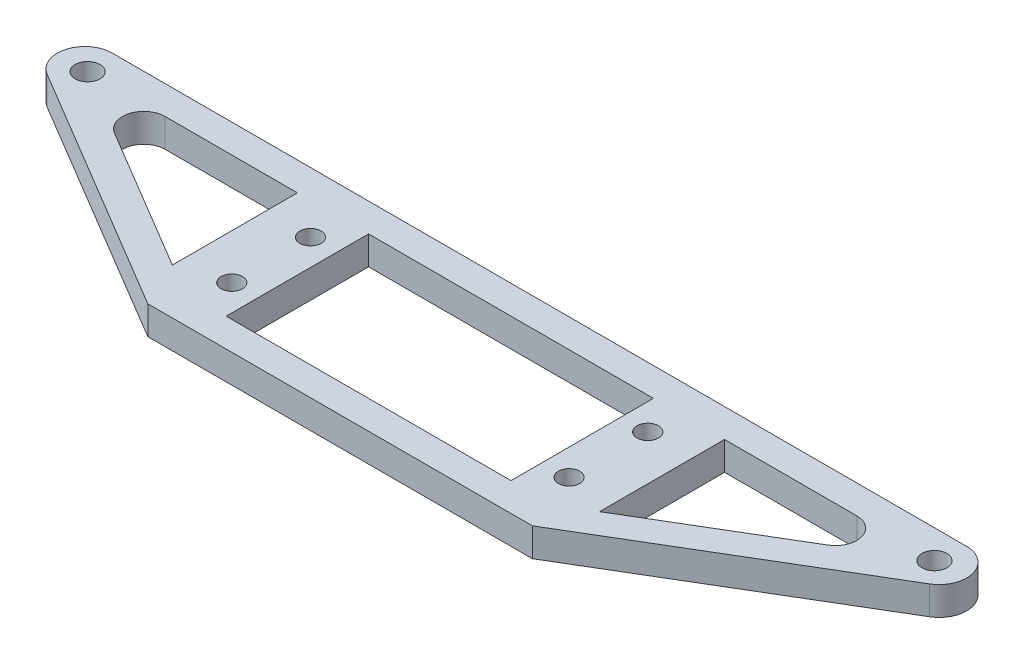
ISO-10303-21;
HEADER;
FILE_DESCRIPTION(('STEP AP214'),'2;1');
FILE_NAME('part.step','',(''),(''),'','','');
FILE_SCHEMA(('AUTOMOTIVE_DESIGN { 1 0 10303 214 1 1 1 1 }'));
ENDSEC;
DATA;
#1=APPLICATION_CONTEXT('core data for automotive mechanical design processes');
#2=APPLICATION_PROTOCOL_DEFINITION('international standard','automotive_design',2000,#1);
#3=PRODUCT_CONTEXT('',#1,'mechanical');
#4=PRODUCT('Part','Part','',(#3));
#5=PRODUCT_RELATED_PRODUCT_CATEGORY('part','',(#4));
#6=PRODUCT_DEFINITION_FORMATION('','',#4);
#7=PRODUCT_DEFINITION_CONTEXT('part definition',#1,'design');
#8=PRODUCT_DEFINITION('design','',#6,#7);
#9=PRODUCT_DEFINITION_SHAPE('','',#8);
#10=(LENGTH_UNIT() NAMED_UNIT(*) SI_UNIT(.MILLI.,.METRE.));
#11=(NAMED_UNIT(*) PLANE_ANGLE_UNIT() SI_UNIT($,.RADIAN.));
#12=(NAMED_UNIT(*) SI_UNIT($,.STERADIAN.) SOLID_ANGLE_UNIT());
#13=UNCERTAINTY_MEASURE_WITH_UNIT(LENGTH_MEASURE(1.E-05),#10,'distance_accuracy_value','');
#14=(GEOMETRIC_REPRESENTATION_CONTEXT(3) GLOBAL_UNCERTAINTY_ASSIGNED_CONTEXT((#13)) GLOBAL_UNIT_ASSIGNED_CONTEXT((#10,
#11,#12)) REPRESENTATION_CONTEXT('',''));
#15=CARTESIAN_POINT('',(0.,0.,0.));
#16=DIRECTION('',(0.,0.,1.));
#17=DIRECTION('',(1.,0.,0.));
#18=AXIS2_PLACEMENT_3D('',#15,#16,#17);
#19=CARTESIAN_POINT('',(60.,4.,-10.1471353709543));
#20=DIRECTION('',(0.,1.,0.));
#21=DIRECTION('',(0.,0.,1.));
#22=AXIS2_PLACEMENT_3D('',#19,#20,#21);
#23=PLANE('',#22);
#24=CARTESIAN_POINT('',(-59.4656013149664,4.,-10.));
#25=DIRECTION('',(0.,1.,0.));
#26=DIRECTION('',(0.,0.,1.));
#27=AXIS2_PLACEMENT_3D('',#24,#25,#26);
#28=CIRCLE('',#27,1.75);
#29=CARTESIAN_POINT('',(-59.4656013149664,4.,-8.25));
#30=VERTEX_POINT('',#29);
#31=EDGE_CURVE('E191',#30,#30,#28,.T.);
#32=ORIENTED_EDGE('',*,*,#31,.F.);
#33=EDGE_LOOP('',(#32));
#34=FACE_BOUND('',#33,.T.);
#35=CARTESIAN_POINT('',(59.4656013149664,4.,-10.));
#36=DIRECTION('',(0.,1.,0.));
#37=DIRECTION('',(0.,0.,1.));
#38=AXIS2_PLACEMENT_3D('',#35,#36,#37);
#39=CIRCLE('',#38,1.75);
#40=CARTESIAN_POINT('',(59.4656013149664,4.,-8.25));
#41=VERTEX_POINT('',#40);
#42=EDGE_CURVE('E649',#41,#41,#39,.T.);
#43=ORIENTED_EDGE('',*,*,#42,.F.);
#44=EDGE_LOOP('',(#43));
#45=FACE_BOUND('',#44,.T.);
#46=CARTESIAN_POINT('',(23.6809604637574,4.,5.52949784874383));
#47=DIRECTION('',(0.,1.,0.));
#48=DIRECTION('',(0.,0.,1.));
#49=AXIS2_PLACEMENT_3D('',#46,#47,#48);
#50=CIRCLE('',#49,1.5);
#51=CARTESIAN_POINT('',(23.6809604637574,4.,7.02949784874383));
#52=VERTEX_POINT('',#51);
#53=EDGE_CURVE('E225',#52,#52,#50,.T.);
#54=ORIENTED_EDGE('',*,*,#53,.F.);
#55=EDGE_LOOP('',(#54));
#56=FACE_BOUND('',#55,.T.);
#57=CARTESIAN_POINT('',(-23.6809604637574,4.,-5.52949784874374));
#58=DIRECTION('',(0.,1.,0.));
#59=DIRECTION('',(0.,0.,1.));
#60=AXIS2_PLACEMENT_3D('',#57,#58,#59);
#61=CIRCLE('',#60,1.5);
#62=CARTESIAN_POINT('',(-23.6809604637574,4.,-4.02949784874374));
#63=VERTEX_POINT('',#62);
#64=EDGE_CURVE('E237',#63,#63,#61,.T.);
#65=ORIENTED_EDGE('',*,*,#64,.F.);
#66=EDGE_LOOP('',(#65));
#67=FACE_BOUND('',#66,.T.);
#68=DIRECTION('',(-1.,0.,0.));
#69=VECTOR('',#68,1.);
#70=CARTESIAN_POINT('',(26.9999999999999,4.,-14.));
#71=LINE('',#70,#69);
#72=CARTESIAN_POINT('',(60.,4.,-14.));
#73=VERTEX_POINT('',#72);
#74=CARTESIAN_POINT('',(-60.,4.,-14.));
#75=VERTEX_POINT('',#74);
#76=EDGE_CURVE('E274',#73,#75,#71,.T.);
#77=ORIENTED_EDGE('',*,*,#76,.T.);
#78=CARTESIAN_POINT('',(-60.,4.,-10.1471353709543));
#79=DIRECTION('',(0.,1.,0.));
#80=DIRECTION('',(0.,0.,-1.));
#81=AXIS2_PLACEMENT_3D('',#78,#79,#80);
#82=CIRCLE('',#81,3.8528646290457);
#83=CARTESIAN_POINT('',(-61.9721116707928,4.,-6.83724996392368));
#84=VERTEX_POINT('',#83);
#85=EDGE_CURVE('E276',#75,#84,#82,.T.);
#86=ORIENTED_EDGE('',*,*,#85,.T.);
#87=DIRECTION('',(0.859071295180808,0.,0.511855946332919));
#88=VECTOR('',#87,1.);
#89=CARTESIAN_POINT('',(-27.0000000000001,4.,14.));
#90=LINE('',#89,#88);
#91=CARTESIAN_POINT('',(-27.0000000000001,4.,14.));
#92=VERTEX_POINT('',#91);
#93=EDGE_CURVE('E279',#84,#92,#90,.T.);
#94=ORIENTED_EDGE('',*,*,#93,.T.);
#95=DIRECTION('',(1.,0.,0.));
#96=VECTOR('',#95,1.);
#97=CARTESIAN_POINT('',(-27.0000000000001,4.,14.));
#98=LINE('',#97,#96);
#99=CARTESIAN_POINT('',(26.9999999999999,4.,14.));
#100=VERTEX_POINT('',#99);
#101=EDGE_CURVE('E281',#92,#100,#98,.T.);
#102=ORIENTED_EDGE('',*,*,#101,.T.);
#103=DIRECTION('',(0.859071295180809,0.,-0.511855946332918));
#104=VECTOR('',#103,1.);
#105=CARTESIAN_POINT('',(26.9999999999999,4.,14.));
#106=LINE('',#105,#104);
#107=CARTESIAN_POINT('',(61.9721116707928,4.,-6.83724996392368));
#108=VERTEX_POINT('',#107);
#109=EDGE_CURVE('E283',#100,#108,#106,.T.);
#110=ORIENTED_EDGE('',*,*,#109,.T.);
#111=CARTESIAN_POINT('',(60.,4.,-10.1471353709543));
#112=DIRECTION('',(0.,1.,0.));
#113=DIRECTION('',(0.,0.,1.));
#114=AXIS2_PLACEMENT_3D('',#111,#112,#113);
#115=CIRCLE('',#114,3.8528646290457);
#116=EDGE_CURVE('E285',#108,#73,#115,.T.);
#117=ORIENTED_EDGE('',*,*,#116,.T.);
#118=EDGE_LOOP('',(#77,#86,#94,#102,#110,#117));
#119=FACE_BOUND('',#118,.T.);
#120=DIRECTION('',(-1.,0.,0.));
#121=VECTOR('',#120,1.);
#122=CARTESIAN_POINT('',(-20.,4.,-10.));
#123=LINE('',#122,#121);
#124=CARTESIAN_POINT('',(20.,4.,-10.));
#125=VERTEX_POINT('',#124);
#126=CARTESIAN_POINT('',(-20.,4.,-10.));
#127=VERTEX_POINT('',#126);
#128=EDGE_CURVE('E245',#125,#127,#123,.T.);
#129=ORIENTED_EDGE('',*,*,#128,.F.);
#130=DIRECTION('',(0.,0.,-1.));
#131=VECTOR('',#130,1.);
#132=CARTESIAN_POINT('',(20.,4.,10.));
#133=LINE('',#132,#131);
#134=CARTESIAN_POINT('',(20.,4.,10.));
#135=VERTEX_POINT('',#134);
#136=EDGE_CURVE('E243',#135,#125,#133,.T.);
#137=ORIENTED_EDGE('',*,*,#136,.F.);
#138=DIRECTION('',(1.,0.,0.));
#139=VECTOR('',#138,1.);
#140=CARTESIAN_POINT('',(-20.,4.,10.));
#141=LINE('',#140,#139);
#142=CARTESIAN_POINT('',(-20.,4.,10.));
#143=VERTEX_POINT('',#142);
#144=EDGE_CURVE('E251',#143,#135,#141,.T.);
#145=ORIENTED_EDGE('',*,*,#144,.F.);
#146=DIRECTION('',(0.,0.,1.));
#147=VECTOR('',#146,1.);
#148=CARTESIAN_POINT('',(-20.,4.,10.));
#149=LINE('',#148,#147);
#150=EDGE_CURVE('E248',#127,#143,#149,.T.);
#151=ORIENTED_EDGE('',*,*,#150,.F.);
#152=EDGE_LOOP('',(#129,#137,#145,#151));
#153=FACE_BOUND('',#152,.T.);
#154=CARTESIAN_POINT('',(-23.6809604637574,4.,5.52949784874374));
#155=DIRECTION('',(0.,1.,0.));
#156=DIRECTION('',(0.,0.,-1.));
#157=AXIS2_PLACEMENT_3D('',#154,#155,#156);
#158=CIRCLE('',#157,1.5);
#159=CARTESIAN_POINT('',(-23.6809604637574,4.,4.02949784874374));
#160=VERTEX_POINT('',#159);
#161=EDGE_CURVE('E231',#160,#160,#158,.T.);
#162=ORIENTED_EDGE('',*,*,#161,.F.);
#163=EDGE_LOOP('',(#162));
#164=FACE_BOUND('',#163,.T.);
#165=CARTESIAN_POINT('',(23.6809604637574,4.,-5.52949784874365));
#166=DIRECTION('',(0.,1.,0.));
#167=DIRECTION('',(0.,0.,-1.));
#168=AXIS2_PLACEMENT_3D('',#165,#166,#167);
#169=CIRCLE('',#168,1.5);
#170=CARTESIAN_POINT('',(23.6809604637574,4.,-7.02949784874365));
#171=VERTEX_POINT('',#170);
#172=EDGE_CURVE('E219',#171,#171,#169,.T.);
#173=ORIENTED_EDGE('',*,*,#172,.F.);
#174=EDGE_LOOP('',(#173));
#175=FACE_BOUND('',#174,.T.);
#176=DIRECTION('',(0.859071295180809,0.,-0.511855946332919));
#177=VECTOR('',#176,1.);
#178=CARTESIAN_POINT('',(59.4656013149664,4.,-10.));
#179=LINE('',#178,#177);
#180=CARTESIAN_POINT('',(30.,4.,7.55633476516793));
#181=VERTEX_POINT('',#180);
#182=CARTESIAN_POINT('',(50.1051076243509,4.,-4.42278611445758));
#183=VERTEX_POINT('',#182);
#184=EDGE_CURVE('E200',#181,#183,#179,.T.);
#185=ORIENTED_EDGE('',*,*,#184,.F.);
#186=DIRECTION('',(0.,0.,1.));
#187=VECTOR('',#186,1.);
#188=CARTESIAN_POINT('',(30.,4.,7.55633476516793));
#189=LINE('',#188,#187);
#190=CARTESIAN_POINT('',(29.9999999999999,4.,-10.));
#191=VERTEX_POINT('',#190);
#192=EDGE_CURVE('E198',#191,#181,#189,.T.);
#193=ORIENTED_EDGE('',*,*,#192,.F.);
#194=DIRECTION('',(-1.,0.,0.));
#195=VECTOR('',#194,1.);
#196=CARTESIAN_POINT('',(29.9999999999999,4.,-10.));
#197=LINE('',#196,#195);
#198=CARTESIAN_POINT('',(48.5695397853522,4.,-10.));
#199=VERTEX_POINT('',#198);
#200=EDGE_CURVE('E204',#199,#191,#197,.T.);
#201=ORIENTED_EDGE('',*,*,#200,.F.);
#202=CARTESIAN_POINT('',(48.5695397853522,4.,-7.));
#203=DIRECTION('',(0.,1.,0.));
#204=DIRECTION('',(0.,0.,1.));
#205=AXIS2_PLACEMENT_3D('',#202,#203,#204);
#206=CIRCLE('',#205,3.);
#207=EDGE_CURVE('E323',#199,#183,#206,.F.);
#208=ORIENTED_EDGE('',*,*,#207,.T.);
#209=EDGE_LOOP('',(#185,#193,#201,#208));
#210=FACE_BOUND('',#209,.T.);
#211=DIRECTION('',(0.859071295180809,0.,0.511855946332919));
#212=VECTOR('',#211,1.);
#213=CARTESIAN_POINT('',(-59.4656013149664,4.,-10.));
#214=LINE('',#213,#212);
#215=CARTESIAN_POINT('',(-50.1051076243509,4.,-4.42278611445757));
#216=VERTEX_POINT('',#215);
#217=CARTESIAN_POINT('',(-29.9999999999999,4.,7.55633476516793));
#218=VERTEX_POINT('',#217);
#219=EDGE_CURVE('E174',#216,#218,#214,.T.);
#220=ORIENTED_EDGE('',*,*,#219,.F.);
#221=CARTESIAN_POINT('',(-48.5695397853522,4.,-7.));
#222=DIRECTION('',(0.,1.,0.));
#223=DIRECTION('',(0.,0.,1.));
#224=AXIS2_PLACEMENT_3D('',#221,#222,#223);
#225=CIRCLE('',#224,3.);
#226=CARTESIAN_POINT('',(-48.5695397853522,4.,-10.));
#227=VERTEX_POINT('',#226);
#228=EDGE_CURVE('E11',#216,#227,#225,.F.);
#229=ORIENTED_EDGE('',*,*,#228,.T.);
#230=DIRECTION('',(-1.,0.,0.));
#231=VECTOR('',#230,1.);
#232=CARTESIAN_POINT('',(-29.9999999999999,4.,-10.));
#233=LINE('',#232,#231);
#234=CARTESIAN_POINT('',(-29.9999999999999,4.,-10.));
#235=VERTEX_POINT('',#234);
#236=EDGE_CURVE('E180',#235,#227,#233,.T.);
#237=ORIENTED_EDGE('',*,*,#236,.F.);
#238=DIRECTION('',(0.,0.,-1.));
#239=VECTOR('',#238,1.);
#240=CARTESIAN_POINT('',(-30.,4.,7.55633476516793));
#241=LINE('',#240,#239);
#242=EDGE_CURVE('E164',#218,#235,#241,.T.);
#243=ORIENTED_EDGE('',*,*,#242,.F.);
#244=EDGE_LOOP('',(#220,#229,#237,#243));
#245=FACE_BOUND('',#244,.T.);
#246=ADVANCED_FACE('F40',(#34,#45,#56,#67,#119,#153,#164,#175,#210,#245),#23,.T.);
#247=CARTESIAN_POINT('',(60.,0.,-10.1471353709543));
#248=DIRECTION('',(0.,1.,0.));
#249=DIRECTION('',(0.,0.,1.));
#250=AXIS2_PLACEMENT_3D('',#247,#248,#249);
#251=PLANE('',#250);
#252=CARTESIAN_POINT('',(-59.4656013149664,0.,-10.));
#253=DIRECTION('',(0.,1.,0.));
#254=DIRECTION('',(0.,0.,1.));
#255=AXIS2_PLACEMENT_3D('',#252,#253,#254);
#256=CIRCLE('',#255,1.75);
#257=CARTESIAN_POINT('',(-59.4656013149664,0.,-8.25));
#258=VERTEX_POINT('',#257);
#259=EDGE_CURVE('E648',#258,#258,#256,.T.);
#260=ORIENTED_EDGE('',*,*,#259,.T.);
#261=EDGE_LOOP('',(#260));
#262=FACE_BOUND('',#261,.T.);
#263=CARTESIAN_POINT('',(59.4656013149664,0.,-10.));
#264=DIRECTION('',(0.,1.,0.));
#265=DIRECTION('',(0.,0.,1.));
#266=AXIS2_PLACEMENT_3D('',#263,#264,#265);
#267=CIRCLE('',#266,1.75);
#268=CARTESIAN_POINT('',(59.4656013149664,0.,-8.25));
#269=VERTEX_POINT('',#268);
#270=EDGE_CURVE('E650',#269,#269,#267,.T.);
#271=ORIENTED_EDGE('',*,*,#270,.T.);
#272=EDGE_LOOP('',(#271));
#273=FACE_BOUND('',#272,.T.);
#274=DIRECTION('',(0.,0.,1.));
#275=VECTOR('',#274,1.);
#276=CARTESIAN_POINT('',(30.,0.,7.55633476516793));
#277=LINE('',#276,#275);
#278=CARTESIAN_POINT('',(29.9999999999999,0.,-10.));
#279=VERTEX_POINT('',#278);
#280=CARTESIAN_POINT('',(30.,0.,7.55633476516793));
#281=VERTEX_POINT('',#280);
#282=EDGE_CURVE('E197',#279,#281,#277,.T.);
#283=ORIENTED_EDGE('',*,*,#282,.T.);
#284=DIRECTION('',(0.859071295180809,0.,-0.511855946332919));
#285=VECTOR('',#284,1.);
#286=CARTESIAN_POINT('',(59.4656013149664,0.,-10.));
#287=LINE('',#286,#285);
#288=CARTESIAN_POINT('',(50.1051076243509,0.,-4.42278611445758));
#289=VERTEX_POINT('',#288);
#290=EDGE_CURVE('E209',#281,#289,#287,.T.);
#291=ORIENTED_EDGE('',*,*,#290,.T.);
#292=CARTESIAN_POINT('',(48.5695397853522,0.,-7.));
#293=DIRECTION('',(0.,1.,0.));
#294=DIRECTION('',(0.,0.,1.));
#295=AXIS2_PLACEMENT_3D('',#292,#293,#294);
#296=CIRCLE('',#295,3.);
#297=CARTESIAN_POINT('',(48.5695397853522,0.,-10.));
#298=VERTEX_POINT('',#297);
#299=EDGE_CURVE('E321',#289,#298,#296,.T.);
#300=ORIENTED_EDGE('',*,*,#299,.T.);
#301=DIRECTION('',(-1.,0.,0.));
#302=VECTOR('',#301,1.);
#303=CARTESIAN_POINT('',(29.9999999999999,0.,-10.));
#304=LINE('',#303,#302);
#305=EDGE_CURVE('E201',#298,#279,#304,.T.);
#306=ORIENTED_EDGE('',*,*,#305,.T.);
#307=EDGE_LOOP('',(#283,#291,#300,#306));
#308=FACE_BOUND('',#307,.T.);
#309=DIRECTION('',(-1.,0.,0.));
#310=VECTOR('',#309,1.);
#311=CARTESIAN_POINT('',(-27.0000000000001,0.,-14.));
#312=LINE('',#311,#310);
#313=CARTESIAN_POINT('',(60.,0.,-14.));
#314=VERTEX_POINT('',#313);
#315=CARTESIAN_POINT('',(-60.,0.,-14.));
#316=VERTEX_POINT('',#315);
#317=EDGE_CURVE('E273',#314,#316,#312,.T.);
#318=ORIENTED_EDGE('',*,*,#317,.F.);
#319=CARTESIAN_POINT('',(60.,0.,-10.1471353709543));
#320=DIRECTION('',(0.,1.,0.));
#321=DIRECTION('',(0.,0.,1.));
#322=AXIS2_PLACEMENT_3D('',#319,#320,#321);
#323=CIRCLE('',#322,3.8528646290457);
#324=CARTESIAN_POINT('',(61.9721116707928,0.,-6.83724996392368));
#325=VERTEX_POINT('',#324);
#326=EDGE_CURVE('E277',#325,#314,#323,.T.);
#327=ORIENTED_EDGE('',*,*,#326,.F.);
#328=DIRECTION('',(0.859071295180809,0.,-0.511855946332918));
#329=VECTOR('',#328,1.);
#330=CARTESIAN_POINT('',(26.9999999999999,0.,14.));
#331=LINE('',#330,#329);
#332=CARTESIAN_POINT('',(26.9999999999999,0.,14.));
#333=VERTEX_POINT('',#332);
#334=EDGE_CURVE('E295',#333,#325,#331,.T.);
#335=ORIENTED_EDGE('',*,*,#334,.F.);
#336=DIRECTION('',(1.,0.,0.));
#337=VECTOR('',#336,1.);
#338=CARTESIAN_POINT('',(-27.0000000000001,0.,14.));
#339=LINE('',#338,#337);
#340=CARTESIAN_POINT('',(-27.0000000000001,0.,14.));
#341=VERTEX_POINT('',#340);
#342=EDGE_CURVE('E293',#341,#333,#339,.T.);
#343=ORIENTED_EDGE('',*,*,#342,.F.);
#344=DIRECTION('',(0.859071295180808,0.,0.511855946332919));
#345=VECTOR('',#344,1.);
#346=CARTESIAN_POINT('',(-27.0000000000001,0.,14.));
#347=LINE('',#346,#345);
#348=CARTESIAN_POINT('',(-61.9721116707928,0.,-6.83724996392368));
#349=VERTEX_POINT('',#348);
#350=EDGE_CURVE('E291',#349,#341,#347,.T.);
#351=ORIENTED_EDGE('',*,*,#350,.F.);
#352=CARTESIAN_POINT('',(-60.,0.,-10.1471353709543));
#353=DIRECTION('',(0.,1.,0.));
#354=DIRECTION('',(0.,0.,-1.));
#355=AXIS2_PLACEMENT_3D('',#352,#353,#354);
#356=CIRCLE('',#355,3.8528646290457);
#357=EDGE_CURVE('E289',#316,#349,#356,.T.);
#358=ORIENTED_EDGE('',*,*,#357,.F.);
#359=EDGE_LOOP('',(#318,#327,#335,#343,#351,#358));
#360=FACE_BOUND('',#359,.T.);
#361=DIRECTION('',(0.,0.,-1.));
#362=VECTOR('',#361,1.);
#363=CARTESIAN_POINT('',(20.,0.,10.));
#364=LINE('',#363,#362);
#365=CARTESIAN_POINT('',(20.,0.,10.));
#366=VERTEX_POINT('',#365);
#367=CARTESIAN_POINT('',(20.,0.,-10.));
#368=VERTEX_POINT('',#367);
#369=EDGE_CURVE('E240',#366,#368,#364,.T.);
#370=ORIENTED_EDGE('',*,*,#369,.T.);
#371=DIRECTION('',(-1.,0.,0.));
#372=VECTOR('',#371,1.);
#373=CARTESIAN_POINT('',(-20.,0.,-10.));
#374=LINE('',#373,#372);
#375=CARTESIAN_POINT('',(-20.,0.,-10.));
#376=VERTEX_POINT('',#375);
#377=EDGE_CURVE('E256',#368,#376,#374,.T.);
#378=ORIENTED_EDGE('',*,*,#377,.T.);
#379=DIRECTION('',(0.,0.,1.));
#380=VECTOR('',#379,1.);
#381=CARTESIAN_POINT('',(-20.,0.,10.));
#382=LINE('',#381,#380);
#383=CARTESIAN_POINT('',(-20.,0.,10.));
#384=VERTEX_POINT('',#383);
#385=EDGE_CURVE('E259',#376,#384,#382,.T.);
#386=ORIENTED_EDGE('',*,*,#385,.T.);
#387=DIRECTION('',(1.,0.,0.));
#388=VECTOR('',#387,1.);
#389=CARTESIAN_POINT('',(-20.,0.,10.));
#390=LINE('',#389,#388);
#391=EDGE_CURVE('E246',#384,#366,#390,.T.);
#392=ORIENTED_EDGE('',*,*,#391,.T.);
#393=EDGE_LOOP('',(#370,#378,#386,#392));
#394=FACE_BOUND('',#393,.T.);
#395=CARTESIAN_POINT('',(-23.6809604637574,0.,-5.52949784874374));
#396=DIRECTION('',(0.,1.,0.));
#397=DIRECTION('',(0.,0.,1.));
#398=AXIS2_PLACEMENT_3D('',#395,#396,#397);
#399=CIRCLE('',#398,1.5);
#400=CARTESIAN_POINT('',(-23.6809604637574,0.,-4.02949784874374));
#401=VERTEX_POINT('',#400);
#402=EDGE_CURVE('E234',#401,#401,#399,.T.);
#403=ORIENTED_EDGE('',*,*,#402,.T.);
#404=EDGE_LOOP('',(#403));
#405=FACE_BOUND('',#404,.T.);
#406=CARTESIAN_POINT('',(-23.6809604637574,0.,5.52949784874374));
#407=DIRECTION('',(0.,1.,0.));
#408=DIRECTION('',(0.,0.,-1.));
#409=AXIS2_PLACEMENT_3D('',#406,#407,#408);
#410=CIRCLE('',#409,1.5);
#411=CARTESIAN_POINT('',(-23.6809604637574,0.,4.02949784874374));
#412=VERTEX_POINT('',#411);
#413=EDGE_CURVE('E228',#412,#412,#410,.T.);
#414=ORIENTED_EDGE('',*,*,#413,.T.);
#415=EDGE_LOOP('',(#414));
#416=FACE_BOUND('',#415,.T.);
#417=CARTESIAN_POINT('',(23.6809604637574,0.,5.52949784874383));
#418=DIRECTION('',(0.,1.,0.));
#419=DIRECTION('',(0.,0.,1.));
#420=AXIS2_PLACEMENT_3D('',#417,#418,#419);
#421=CIRCLE('',#420,1.5);
#422=CARTESIAN_POINT('',(23.6809604637574,0.,7.02949784874383));
#423=VERTEX_POINT('',#422);
#424=EDGE_CURVE('E222',#423,#423,#421,.T.);
#425=ORIENTED_EDGE('',*,*,#424,.T.);
#426=EDGE_LOOP('',(#425));
#427=FACE_BOUND('',#426,.T.);
#428=CARTESIAN_POINT('',(23.6809604637574,0.,-5.52949784874365));
#429=DIRECTION('',(0.,1.,0.));
#430=DIRECTION('',(0.,0.,-1.));
#431=AXIS2_PLACEMENT_3D('',#428,#429,#430);
#432=CIRCLE('',#431,1.5);
#433=CARTESIAN_POINT('',(23.6809604637574,0.,-7.02949784874365));
#434=VERTEX_POINT('',#433);
#435=EDGE_CURVE('E218',#434,#434,#432,.T.);
#436=ORIENTED_EDGE('',*,*,#435,.T.);
#437=EDGE_LOOP('',(#436));
#438=FACE_BOUND('',#437,.T.);
#439=DIRECTION('',(-1.,0.,0.));
#440=VECTOR('',#439,1.);
#441=CARTESIAN_POINT('',(-29.9999999999999,0.,-10.));
#442=LINE('',#441,#440);
#443=CARTESIAN_POINT('',(-29.9999999999999,0.,-10.));
#444=VERTEX_POINT('',#443);
#445=CARTESIAN_POINT('',(-48.5695397853522,0.,-10.));
#446=VERTEX_POINT('',#445);
#447=EDGE_CURVE('E182',#444,#446,#442,.T.);
#448=ORIENTED_EDGE('',*,*,#447,.T.);
#449=CARTESIAN_POINT('',(-48.5695397853522,0.,-7.));
#450=DIRECTION('',(0.,1.,0.));
#451=DIRECTION('',(0.,0.,1.));
#452=AXIS2_PLACEMENT_3D('',#449,#450,#451);
#453=CIRCLE('',#452,3.);
#454=CARTESIAN_POINT('',(-50.1051076243509,0.,-4.42278611445757));
#455=VERTEX_POINT('',#454);
#456=EDGE_CURVE('E48',#446,#455,#453,.T.);
#457=ORIENTED_EDGE('',*,*,#456,.T.);
#458=DIRECTION('',(0.859071295180809,0.,0.511855946332919));
#459=VECTOR('',#458,1.);
#460=CARTESIAN_POINT('',(-59.4656013149664,0.,-10.));
#461=LINE('',#460,#459);
#462=CARTESIAN_POINT('',(-30.,0.,7.55633476516793));
#463=VERTEX_POINT('',#462);
#464=EDGE_CURVE('E188',#455,#463,#461,.T.);
#465=ORIENTED_EDGE('',*,*,#464,.T.);
#466=DIRECTION('',(0.,0.,-1.));
#467=VECTOR('',#466,1.);
#468=CARTESIAN_POINT('',(-30.,0.,7.55633476516793));
#469=LINE('',#468,#467);
#470=EDGE_CURVE('E185',#463,#444,#469,.T.);
#471=ORIENTED_EDGE('',*,*,#470,.T.);
#472=EDGE_LOOP('',(#448,#457,#465,#471));
#473=FACE_BOUND('',#472,.T.);
#474=ADVANCED_FACE('F328',(#262,#273,#308,#360,#394,#405,#416,#427,#438,#473),#251,.F.);
#475=CARTESIAN_POINT('',(-27.0000000000001,4.,-14.));
#476=DIRECTION('',(0.,0.,1.));
#477=DIRECTION('',(1.,0.,0.));
#478=AXIS2_PLACEMENT_3D('',#475,#476,#477);
#479=PLANE('',#478);
#480=ORIENTED_EDGE('',*,*,#317,.T.);
#481=DIRECTION('',(0.,-1.,0.));
#482=VECTOR('',#481,1.);
#483=CARTESIAN_POINT('',(-60.,4.,-14.));
#484=LINE('',#483,#482);
#485=EDGE_CURVE('E313',#75,#316,#484,.T.);
#486=ORIENTED_EDGE('',*,*,#485,.F.);
#487=ORIENTED_EDGE('',*,*,#76,.F.);
#488=DIRECTION('',(0.,-1.,0.));
#489=VECTOR('',#488,1.);
#490=CARTESIAN_POINT('',(60.,4.,-14.));
#491=LINE('',#490,#489);
#492=EDGE_CURVE('E287',#73,#314,#491,.T.);
#493=ORIENTED_EDGE('',*,*,#492,.T.);
#494=EDGE_LOOP('',(#480,#486,#487,#493));
#495=FACE_BOUND('',#494,.T.);
#496=ADVANCED_FACE('F348',(#495),#479,.F.);
#497=CARTESIAN_POINT('',(-60.,4.,-10.1471353709543));
#498=DIRECTION('',(0.,-1.,0.));
#499=DIRECTION('',(0.,0.,-1.));
#500=AXIS2_PLACEMENT_3D('',#497,#498,#499);
#501=CYLINDRICAL_SURFACE('',#500,3.8528646290457);
#502=ORIENTED_EDGE('',*,*,#357,.T.);
#503=DIRECTION('',(0.,-1.,0.));
#504=VECTOR('',#503,1.);
#505=CARTESIAN_POINT('',(-61.9721116707928,4.,-6.83724996392368));
#506=LINE('',#505,#504);
#507=EDGE_CURVE('E310',#84,#349,#506,.T.);
#508=ORIENTED_EDGE('',*,*,#507,.F.);
#509=ORIENTED_EDGE('',*,*,#85,.F.);
#510=ORIENTED_EDGE('',*,*,#485,.T.);
#511=EDGE_LOOP('',(#502,#508,#509,#510));
#512=FACE_BOUND('',#511,.T.);
#513=ADVANCED_FACE('F372',(#512),#501,.T.);
#514=CARTESIAN_POINT('',(-27.0000000000001,4.,14.));
#515=DIRECTION('',(0.511855946332919,0.,-0.859071295180808));
#516=DIRECTION('',(-0.859071295180808,0.,-0.51185594633292));
#517=AXIS2_PLACEMENT_3D('',#514,#515,#516);
#518=PLANE('',#517);
#519=ORIENTED_EDGE('',*,*,#350,.T.);
#520=DIRECTION('',(0.,-1.,0.));
#521=VECTOR('',#520,1.);
#522=CARTESIAN_POINT('',(-27.0000000000001,4.,14.));
#523=LINE('',#522,#521);
#524=EDGE_CURVE('E307',#92,#341,#523,.T.);
#525=ORIENTED_EDGE('',*,*,#524,.F.);
#526=ORIENTED_EDGE('',*,*,#93,.F.);
#527=ORIENTED_EDGE('',*,*,#507,.T.);
#528=EDGE_LOOP('',(#519,#525,#526,#527));
#529=FACE_BOUND('',#528,.T.);
#530=ADVANCED_FACE('F368',(#529),#518,.F.);
#531=CARTESIAN_POINT('',(-27.0000000000001,4.,14.));
#532=DIRECTION('',(0.,0.,-1.));
#533=DIRECTION('',(-1.,0.,0.));
#534=AXIS2_PLACEMENT_3D('',#531,#532,#533);
#535=PLANE('',#534);
#536=ORIENTED_EDGE('',*,*,#342,.T.);
#537=DIRECTION('',(0.,-1.,0.));
#538=VECTOR('',#537,1.);
#539=CARTESIAN_POINT('',(26.9999999999999,4.,14.));
#540=LINE('',#539,#538);
#541=EDGE_CURVE('E304',#100,#333,#540,.T.);
#542=ORIENTED_EDGE('',*,*,#541,.F.);
#543=ORIENTED_EDGE('',*,*,#101,.F.);
#544=ORIENTED_EDGE('',*,*,#524,.T.);
#545=EDGE_LOOP('',(#536,#542,#543,#544));
#546=FACE_BOUND('',#545,.T.);
#547=ADVANCED_FACE('F364',(#546),#535,.F.);
#548=CARTESIAN_POINT('',(26.9999999999999,4.,14.));
#549=DIRECTION('',(-0.511855946332918,0.,-0.859071295180809));
#550=DIRECTION('',(-0.859071295180809,0.,0.511855946332918));
#551=AXIS2_PLACEMENT_3D('',#548,#549,#550);
#552=PLANE('',#551);
#553=ORIENTED_EDGE('',*,*,#334,.T.);
#554=DIRECTION('',(0.,-1.,0.));
#555=VECTOR('',#554,1.);
#556=CARTESIAN_POINT('',(61.9721116707928,4.,-6.83724996392368));
#557=LINE('',#556,#555);
#558=EDGE_CURVE('E301',#108,#325,#557,.T.);
#559=ORIENTED_EDGE('',*,*,#558,.F.);
#560=ORIENTED_EDGE('',*,*,#109,.F.);
#561=ORIENTED_EDGE('',*,*,#541,.T.);
#562=EDGE_LOOP('',(#553,#559,#560,#561));
#563=FACE_BOUND('',#562,.T.);
#564=ADVANCED_FACE('F360',(#563),#552,.F.);
#565=CARTESIAN_POINT('',(60.,4.,-10.1471353709543));
#566=DIRECTION('',(0.,-1.,0.));
#567=DIRECTION('',(0.,0.,-1.));
#568=AXIS2_PLACEMENT_3D('',#565,#566,#567);
#569=CYLINDRICAL_SURFACE('',#568,3.8528646290457);
#570=ORIENTED_EDGE('',*,*,#326,.T.);
#571=ORIENTED_EDGE('',*,*,#492,.F.);
#572=ORIENTED_EDGE('',*,*,#116,.F.);
#573=ORIENTED_EDGE('',*,*,#558,.T.);
#574=EDGE_LOOP('',(#570,#571,#572,#573));
#575=FACE_BOUND('',#574,.T.);
#576=ADVANCED_FACE('F357',(#575),#569,.T.);
#577=CARTESIAN_POINT('',(20.,4.,10.));
#578=DIRECTION('',(-1.,0.,0.));
#579=DIRECTION('',(0.,0.,1.));
#580=AXIS2_PLACEMENT_3D('',#577,#578,#579);
#581=PLANE('',#580);
#582=ORIENTED_EDGE('',*,*,#369,.F.);
#583=DIRECTION('',(0.,-1.,0.));
#584=VECTOR('',#583,1.);
#585=CARTESIAN_POINT('',(20.,4.,10.));
#586=LINE('',#585,#584);
#587=EDGE_CURVE('E253',#135,#366,#586,.T.);
#588=ORIENTED_EDGE('',*,*,#587,.F.);
#589=ORIENTED_EDGE('',*,*,#136,.T.);
#590=DIRECTION('',(0.,-1.,0.));
#591=VECTOR('',#590,1.);
#592=CARTESIAN_POINT('',(20.,4.,-10.));
#593=LINE('',#592,#591);
#594=EDGE_CURVE('E270',#125,#368,#593,.T.);
#595=ORIENTED_EDGE('',*,*,#594,.T.);
#596=EDGE_LOOP('',(#582,#588,#589,#595));
#597=FACE_BOUND('',#596,.T.);
#598=ADVANCED_FACE('F354',(#597),#581,.T.);
#599=CARTESIAN_POINT('',(-20.,4.,-10.));
#600=DIRECTION('',(0.,0.,1.));
#601=DIRECTION('',(1.,0.,0.));
#602=AXIS2_PLACEMENT_3D('',#599,#600,#601);
#603=PLANE('',#602);
#604=ORIENTED_EDGE('',*,*,#377,.F.);
#605=ORIENTED_EDGE('',*,*,#594,.F.);
#606=ORIENTED_EDGE('',*,*,#128,.T.);
#607=DIRECTION('',(0.,-1.,0.));
#608=VECTOR('',#607,1.);
#609=CARTESIAN_POINT('',(-20.,4.,-10.));
#610=LINE('',#609,#608);
#611=EDGE_CURVE('E268',#127,#376,#610,.T.);
#612=ORIENTED_EDGE('',*,*,#611,.T.);
#613=EDGE_LOOP('',(#604,#605,#606,#612));
#614=FACE_BOUND('',#613,.T.);
#615=ADVANCED_FACE('F458',(#614),#603,.T.);
#616=CARTESIAN_POINT('',(-20.,4.,10.));
#617=DIRECTION('',(1.,0.,0.));
#618=DIRECTION('',(0.,0.,-1.));
#619=AXIS2_PLACEMENT_3D('',#616,#617,#618);
#620=PLANE('',#619);
#621=ORIENTED_EDGE('',*,*,#385,.F.);
#622=ORIENTED_EDGE('',*,*,#611,.F.);
#623=ORIENTED_EDGE('',*,*,#150,.T.);
#624=DIRECTION('',(0.,-1.,0.));
#625=VECTOR('',#624,1.);
#626=CARTESIAN_POINT('',(-20.,4.,10.));
#627=LINE('',#626,#625);
#628=EDGE_CURVE('E266',#143,#384,#627,.T.);
#629=ORIENTED_EDGE('',*,*,#628,.T.);
#630=EDGE_LOOP('',(#621,#622,#623,#629));
#631=FACE_BOUND('',#630,.T.);
#632=ADVANCED_FACE('F455',(#631),#620,.T.);
#633=CARTESIAN_POINT('',(-20.,4.,10.));
#634=DIRECTION('',(0.,0.,-1.));
#635=DIRECTION('',(-1.,0.,0.));
#636=AXIS2_PLACEMENT_3D('',#633,#634,#635);
#637=PLANE('',#636);
#638=ORIENTED_EDGE('',*,*,#391,.F.);
#639=ORIENTED_EDGE('',*,*,#628,.F.);
#640=ORIENTED_EDGE('',*,*,#144,.T.);
#641=ORIENTED_EDGE('',*,*,#587,.T.);
#642=EDGE_LOOP('',(#638,#639,#640,#641));
#643=FACE_BOUND('',#642,.T.);
#644=ADVANCED_FACE('F451',(#643),#637,.T.);
#645=CARTESIAN_POINT('',(-23.6809604637574,4.,-5.52949784874374));
#646=DIRECTION('',(0.,-1.,0.));
#647=DIRECTION('',(0.,0.,-1.));
#648=AXIS2_PLACEMENT_3D('',#645,#646,#647);
#649=CYLINDRICAL_SURFACE('',#648,1.5);
#650=ORIENTED_EDGE('',*,*,#64,.T.);
#651=EDGE_LOOP('',(#650));
#652=FACE_BOUND('',#651,.T.);
#653=ORIENTED_EDGE('',*,*,#402,.F.);
#654=EDGE_LOOP('',(#653));
#655=FACE_BOUND('',#654,.T.);
#656=ADVANCED_FACE('F447',(#652,#655),#649,.F.);
#657=CARTESIAN_POINT('',(-23.6809604637574,4.,5.52949784874374));
#658=DIRECTION('',(0.,-1.,0.));
#659=DIRECTION('',(0.,0.,-1.));
#660=AXIS2_PLACEMENT_3D('',#657,#658,#659);
#661=CYLINDRICAL_SURFACE('',#660,1.5);
#662=ORIENTED_EDGE('',*,*,#161,.T.);
#663=EDGE_LOOP('',(#662));
#664=FACE_BOUND('',#663,.T.);
#665=ORIENTED_EDGE('',*,*,#413,.F.);
#666=EDGE_LOOP('',(#665));
#667=FACE_BOUND('',#666,.T.);
#668=ADVANCED_FACE('F443',(#664,#667),#661,.F.);
#669=CARTESIAN_POINT('',(23.6809604637574,4.,5.52949784874383));
#670=DIRECTION('',(0.,-1.,0.));
#671=DIRECTION('',(0.,0.,-1.));
#672=AXIS2_PLACEMENT_3D('',#669,#670,#671);
#673=CYLINDRICAL_SURFACE('',#672,1.5);
#674=ORIENTED_EDGE('',*,*,#53,.T.);
#675=EDGE_LOOP('',(#674));
#676=FACE_BOUND('',#675,.T.);
#677=ORIENTED_EDGE('',*,*,#424,.F.);
#678=EDGE_LOOP('',(#677));
#679=FACE_BOUND('',#678,.T.);
#680=ADVANCED_FACE('F436',(#676,#679),#673,.F.);
#681=CARTESIAN_POINT('',(23.6809604637574,4.,-5.52949784874365));
#682=DIRECTION('',(0.,-1.,0.));
#683=DIRECTION('',(0.,0.,-1.));
#684=AXIS2_PLACEMENT_3D('',#681,#682,#683);
#685=CYLINDRICAL_SURFACE('',#684,1.5);
#686=ORIENTED_EDGE('',*,*,#172,.T.);
#687=EDGE_LOOP('',(#686));
#688=FACE_BOUND('',#687,.T.);
#689=ORIENTED_EDGE('',*,*,#435,.F.);
#690=EDGE_LOOP('',(#689));
#691=FACE_BOUND('',#690,.T.);
#692=ADVANCED_FACE('F428',(#688,#691),#685,.F.);
#693=CARTESIAN_POINT('',(30.,4.,7.55633476516793));
#694=DIRECTION('',(1.,0.,0.));
#695=DIRECTION('',(0.,0.,-1.));
#696=AXIS2_PLACEMENT_3D('',#693,#694,#695);
#697=PLANE('',#696);
#698=ORIENTED_EDGE('',*,*,#282,.F.);
#699=DIRECTION('',(0.,-1.,0.));
#700=VECTOR('',#699,1.);
#701=CARTESIAN_POINT('',(29.9999999999999,4.,-10.));
#702=LINE('',#701,#700);
#703=EDGE_CURVE('E206',#191,#279,#702,.T.);
#704=ORIENTED_EDGE('',*,*,#703,.F.);
#705=ORIENTED_EDGE('',*,*,#192,.T.);
#706=DIRECTION('',(0.,-1.,0.));
#707=VECTOR('',#706,1.);
#708=CARTESIAN_POINT('',(30.,4.,7.55633476516793));
#709=LINE('',#708,#707);
#710=EDGE_CURVE('E215',#181,#281,#709,.T.);
#711=ORIENTED_EDGE('',*,*,#710,.T.);
#712=EDGE_LOOP('',(#698,#704,#705,#711));
#713=FACE_BOUND('',#712,.T.);
#714=ADVANCED_FACE('F426',(#713),#697,.T.);
#715=CARTESIAN_POINT('',(59.4656013149664,4.,-10.));
#716=DIRECTION('',(-0.511855946332919,0.,-0.859071295180809));
#717=DIRECTION('',(-0.859071295180809,0.,0.511855946332919));
#718=AXIS2_PLACEMENT_3D('',#715,#716,#717);
#719=PLANE('',#718);
#720=ORIENTED_EDGE('',*,*,#184,.T.);
#721=DIRECTION('',(0.,-1.,0.));
#722=VECTOR('',#721,1.);
#723=CARTESIAN_POINT('',(50.1051076243509,0.,-4.42278611445758));
#724=LINE('',#723,#722);
#725=EDGE_CURVE('E316',#183,#289,#724,.T.);
#726=ORIENTED_EDGE('',*,*,#725,.T.);
#727=ORIENTED_EDGE('',*,*,#290,.F.);
#728=ORIENTED_EDGE('',*,*,#710,.F.);
#729=EDGE_LOOP('',(#720,#726,#727,#728));
#730=FACE_BOUND('',#729,.T.);
#731=ADVANCED_FACE('F417',(#730),#719,.T.);
#732=CARTESIAN_POINT('',(29.9999999999999,4.,-10.));
#733=DIRECTION('',(0.,0.,1.));
#734=DIRECTION('',(1.,0.,0.));
#735=AXIS2_PLACEMENT_3D('',#732,#733,#734);
#736=PLANE('',#735);
#737=ORIENTED_EDGE('',*,*,#305,.F.);
#738=DIRECTION('',(0.,-1.,0.));
#739=VECTOR('',#738,1.);
#740=CARTESIAN_POINT('',(48.5695397853522,4.,-10.));
#741=LINE('',#740,#739);
#742=EDGE_CURVE('E319',#298,#199,#741,.F.);
#743=ORIENTED_EDGE('',*,*,#742,.T.);
#744=ORIENTED_EDGE('',*,*,#200,.T.);
#745=ORIENTED_EDGE('',*,*,#703,.T.);
#746=EDGE_LOOP('',(#737,#743,#744,#745));
#747=FACE_BOUND('',#746,.T.);
#748=ADVANCED_FACE('F423',(#747),#736,.T.);
#749=CARTESIAN_POINT('',(-29.9999999999999,4.,-10.));
#750=DIRECTION('',(0.,0.,1.));
#751=DIRECTION('',(1.,0.,0.));
#752=AXIS2_PLACEMENT_3D('',#749,#750,#751);
#753=PLANE('',#752);
#754=ORIENTED_EDGE('',*,*,#236,.T.);
#755=DIRECTION('',(0.,-1.,0.));
#756=VECTOR('',#755,1.);
#757=CARTESIAN_POINT('',(-48.5695397853522,0.,-10.));
#758=LINE('',#757,#756);
#759=EDGE_CURVE('E325',#227,#446,#758,.T.);
#760=ORIENTED_EDGE('',*,*,#759,.T.);
#761=ORIENTED_EDGE('',*,*,#447,.F.);
#762=DIRECTION('',(0.,-1.,0.));
#763=VECTOR('',#762,1.);
#764=CARTESIAN_POINT('',(-29.9999999999999,4.,-10.));
#765=LINE('',#764,#763);
#766=EDGE_CURVE('E168',#235,#444,#765,.T.);
#767=ORIENTED_EDGE('',*,*,#766,.F.);
#768=EDGE_LOOP('',(#754,#760,#761,#767));
#769=FACE_BOUND('',#768,.T.);
#770=ADVANCED_FACE('F178',(#769),#753,.T.);
#771=CARTESIAN_POINT('',(-59.4656013149664,4.,-10.));
#772=DIRECTION('',(0.511855946332919,0.,-0.859071295180809));
#773=DIRECTION('',(-0.859071295180809,0.,-0.511855946332919));
#774=AXIS2_PLACEMENT_3D('',#771,#772,#773);
#775=PLANE('',#774);
#776=ORIENTED_EDGE('',*,*,#464,.F.);
#777=DIRECTION('',(0.,-1.,0.));
#778=VECTOR('',#777,1.);
#779=CARTESIAN_POINT('',(-50.1051076243509,4.,-4.42278611445757));
#780=LINE('',#779,#778);
#781=EDGE_CURVE('E55',#455,#216,#780,.F.);
#782=ORIENTED_EDGE('',*,*,#781,.T.);
#783=ORIENTED_EDGE('',*,*,#219,.T.);
#784=DIRECTION('',(0.,-1.,0.));
#785=VECTOR('',#784,1.);
#786=CARTESIAN_POINT('',(-30.,4.,7.55633476516793));
#787=LINE('',#786,#785);
#788=EDGE_CURVE('E171',#218,#463,#787,.T.);
#789=ORIENTED_EDGE('',*,*,#788,.T.);
#790=EDGE_LOOP('',(#776,#782,#783,#789));
#791=FACE_BOUND('',#790,.T.);
#792=ADVANCED_FACE('F329',(#791),#775,.T.);
#793=CARTESIAN_POINT('',(-30.,4.,7.55633476516793));
#794=DIRECTION('',(-1.,0.,0.));
#795=DIRECTION('',(0.,0.,1.));
#796=AXIS2_PLACEMENT_3D('',#793,#794,#795);
#797=PLANE('',#796);
#798=ORIENTED_EDGE('',*,*,#470,.F.);
#799=ORIENTED_EDGE('',*,*,#788,.F.);
#800=ORIENTED_EDGE('',*,*,#242,.T.);
#801=ORIENTED_EDGE('',*,*,#766,.T.);
#802=EDGE_LOOP('',(#798,#799,#800,#801));
#803=FACE_BOUND('',#802,.T.);
#804=ADVANCED_FACE('F167',(#803),#797,.T.);
#805=CARTESIAN_POINT('',(48.5695397853522,4.,-7.));
#806=DIRECTION('',(0.,1.,0.));
#807=DIRECTION('',(0.,0.,1.));
#808=AXIS2_PLACEMENT_3D('',#805,#806,#807);
#809=CYLINDRICAL_SURFACE('',#808,3.);
#810=ORIENTED_EDGE('',*,*,#207,.F.);
#811=ORIENTED_EDGE('',*,*,#742,.F.);
#812=ORIENTED_EDGE('',*,*,#299,.F.);
#813=ORIENTED_EDGE('',*,*,#725,.F.);
#814=EDGE_LOOP('',(#810,#811,#812,#813));
#815=FACE_BOUND('',#814,.T.);
#816=ADVANCED_FACE('F332',(#815),#809,.F.);
#817=CARTESIAN_POINT('',(-48.5695397853522,4.,-7.));
#818=DIRECTION('',(0.,1.,0.));
#819=DIRECTION('',(0.,0.,1.));
#820=AXIS2_PLACEMENT_3D('',#817,#818,#819);
#821=CYLINDRICAL_SURFACE('',#820,3.);
#822=ORIENTED_EDGE('',*,*,#228,.F.);
#823=ORIENTED_EDGE('',*,*,#781,.F.);
#824=ORIENTED_EDGE('',*,*,#456,.F.);
#825=ORIENTED_EDGE('',*,*,#759,.F.);
#826=EDGE_LOOP('',(#822,#823,#824,#825));
#827=FACE_BOUND('',#826,.T.);
#828=ADVANCED_FACE('F42',(#827),#821,.F.);
#829=CARTESIAN_POINT('',(59.4656013149664,0.,-10.));
#830=DIRECTION('',(0.,1.,0.));
#831=DIRECTION('',(0.,0.,1.));
#832=AXIS2_PLACEMENT_3D('',#829,#830,#831);
#833=CYLINDRICAL_SURFACE('',#832,1.75);
#834=ORIENTED_EDGE('',*,*,#42,.T.);
#835=EDGE_LOOP('',(#834));
#836=FACE_BOUND('',#835,.T.);
#837=ORIENTED_EDGE('',*,*,#270,.F.);
#838=EDGE_LOOP('',(#837));
#839=FACE_BOUND('',#838,.T.);
#840=ADVANCED_FACE('F331',(#836,#839),#833,.F.);
#841=CARTESIAN_POINT('',(-59.4656013149664,0.,-10.));
#842=DIRECTION('',(0.,1.,0.));
#843=DIRECTION('',(0.,0.,1.));
#844=AXIS2_PLACEMENT_3D('',#841,#842,#843);
#845=CYLINDRICAL_SURFACE('',#844,1.75);
#846=ORIENTED_EDGE('',*,*,#31,.T.);
#847=EDGE_LOOP('',(#846));
#848=FACE_BOUND('',#847,.T.);
#849=ORIENTED_EDGE('',*,*,#259,.F.);
#850=EDGE_LOOP('',(#849));
#851=FACE_BOUND('',#850,.T.);
#852=ADVANCED_FACE('F338',(#848,#851),#845,.F.);
#853=CLOSED_SHELL('',(#246,#474,#496,#513,#530,#547,#564,#576,#598,#615,#632,#644,#656,#668,
#680,#692,#714,#731,#748,#770,#792,#804,#816,#828,#840,#852));
#854=MANIFOLD_SOLID_BREP('B2',#853);
#855=ADVANCED_BREP_SHAPE_REPRESENTATION('',(#18,#854),#14);
#856=SHAPE_DEFINITION_REPRESENTATION(#9,#855);
ENDSEC;
END-ISO-10303-21;
